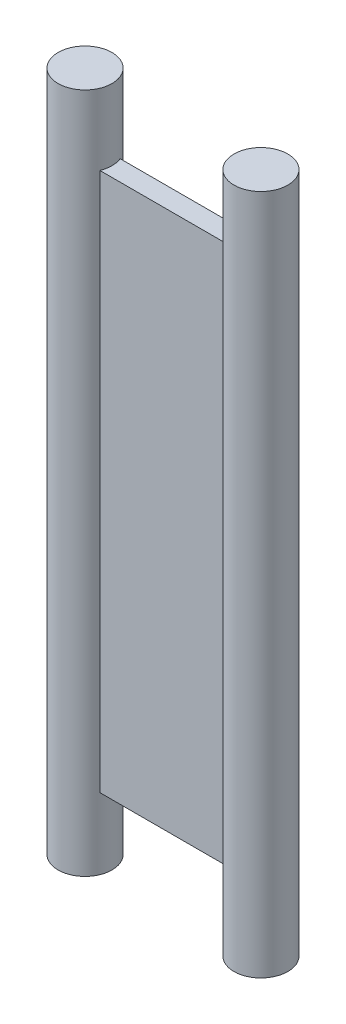
ISO-10303-21;
HEADER;
FILE_DESCRIPTION(('STEP AP214'),'2;1');
FILE_NAME('part.step','',(''),(''),'','','');
FILE_SCHEMA(('AUTOMOTIVE_DESIGN { 1 0 10303 214 1 1 1 1 }'));
ENDSEC;
DATA;
#1=APPLICATION_CONTEXT('core data for automotive mechanical design processes');
#2=APPLICATION_PROTOCOL_DEFINITION('international standard','automotive_design',2000,#1);
#3=PRODUCT_CONTEXT('',#1,'mechanical');
#4=PRODUCT('Part','Part','',(#3));
#5=PRODUCT_RELATED_PRODUCT_CATEGORY('part','',(#4));
#6=PRODUCT_DEFINITION_FORMATION('','',#4);
#7=PRODUCT_DEFINITION_CONTEXT('part definition',#1,'design');
#8=PRODUCT_DEFINITION('design','',#6,#7);
#9=PRODUCT_DEFINITION_SHAPE('','',#8);
#10=(LENGTH_UNIT() NAMED_UNIT(*) SI_UNIT(.MILLI.,.METRE.));
#11=(NAMED_UNIT(*) PLANE_ANGLE_UNIT() SI_UNIT($,.RADIAN.));
#12=(NAMED_UNIT(*) SI_UNIT($,.STERADIAN.) SOLID_ANGLE_UNIT());
#13=UNCERTAINTY_MEASURE_WITH_UNIT(LENGTH_MEASURE(1.E-05),#10,'distance_accuracy_value','');
#14=(GEOMETRIC_REPRESENTATION_CONTEXT(3) GLOBAL_UNCERTAINTY_ASSIGNED_CONTEXT((#13)) GLOBAL_UNIT_ASSIGNED_CONTEXT((#10,
#11,#12)) REPRESENTATION_CONTEXT('',''));
#15=CARTESIAN_POINT('',(0.,0.,0.));
#16=DIRECTION('',(0.,0.,1.));
#17=DIRECTION('',(1.,0.,0.));
#18=AXIS2_PLACEMENT_3D('',#15,#16,#17);
#19=CARTESIAN_POINT('',(4.325,26.5,0.499999999999999));
#20=DIRECTION('',(0.,0.,-1.));
#21=DIRECTION('',(-1.,0.,0.));
#22=AXIS2_PLACEMENT_3D('',#19,#20,#21);
#23=PLANE('',#22);
#24=DIRECTION('',(0.,-1.,0.));
#25=VECTOR('',#24,1.);
#26=CARTESIAN_POINT('',(3.0979608808192,30.,0.5));
#27=LINE('',#26,#25);
#28=CARTESIAN_POINT('',(3.0979608808192,26.5,0.5));
#29=VERTEX_POINT('',#28);
#30=CARTESIAN_POINT('',(3.0979608808192,0.,0.5));
#31=VERTEX_POINT('',#30);
#32=EDGE_CURVE('E53',#29,#31,#27,.T.);
#33=ORIENTED_EDGE('',*,*,#32,.F.);
#34=DIRECTION('',(1.,0.,0.));
#35=VECTOR('',#34,1.);
#36=CARTESIAN_POINT('',(4.325,26.5,0.499999999999999));
#37=LINE('',#36,#35);
#38=CARTESIAN_POINT('',(-3.0979608808192,26.5,0.5));
#39=VERTEX_POINT('',#38);
#40=EDGE_CURVE('E90',#39,#29,#37,.T.);
#41=ORIENTED_EDGE('',*,*,#40,.F.);
#42=DIRECTION('',(0.,-1.,0.));
#43=VECTOR('',#42,1.);
#44=CARTESIAN_POINT('',(-3.0979608808192,30.,0.5));
#45=LINE('',#44,#43);
#46=CARTESIAN_POINT('',(-3.0979608808192,0.,0.5));
#47=VERTEX_POINT('',#46);
#48=EDGE_CURVE('E103',#47,#39,#45,.F.);
#49=ORIENTED_EDGE('',*,*,#48,.F.);
#50=DIRECTION('',(1.,0.,0.));
#51=VECTOR('',#50,1.);
#52=CARTESIAN_POINT('',(4.325,0.,0.499999999999999));
#53=LINE('',#52,#51);
#54=EDGE_CURVE('E91',#47,#31,#53,.T.);
#55=ORIENTED_EDGE('',*,*,#54,.T.);
#56=EDGE_LOOP('',(#33,#41,#49,#55));
#57=FACE_BOUND('',#56,.T.);
#58=ADVANCED_FACE('F39',(#57),#23,.F.);
#59=CARTESIAN_POINT('',(4.325,26.5,-0.500000000000001));
#60=DIRECTION('',(0.,0.,1.));
#61=DIRECTION('',(1.,0.,0.));
#62=AXIS2_PLACEMENT_3D('',#59,#60,#61);
#63=PLANE('',#62);
#64=DIRECTION('',(0.,-1.,0.));
#65=VECTOR('',#64,1.);
#66=CARTESIAN_POINT('',(3.0979608808192,30.,-0.5));
#67=LINE('',#66,#65);
#68=CARTESIAN_POINT('',(3.0979608808192,0.,-0.5));
#69=VERTEX_POINT('',#68);
#70=CARTESIAN_POINT('',(3.0979608808192,26.5,-0.5));
#71=VERTEX_POINT('',#70);
#72=EDGE_CURVE('E78',#69,#71,#67,.F.);
#73=ORIENTED_EDGE('',*,*,#72,.F.);
#74=DIRECTION('',(-1.,0.,0.));
#75=VECTOR('',#74,1.);
#76=CARTESIAN_POINT('',(4.325,0.,-0.500000000000001));
#77=LINE('',#76,#75);
#78=CARTESIAN_POINT('',(-3.0979608808192,0.,-0.5));
#79=VERTEX_POINT('',#78);
#80=EDGE_CURVE('E60',#69,#79,#77,.T.);
#81=ORIENTED_EDGE('',*,*,#80,.T.);
#82=DIRECTION('',(0.,-1.,0.));
#83=VECTOR('',#82,1.);
#84=CARTESIAN_POINT('',(-3.0979608808192,30.,-0.5));
#85=LINE('',#84,#83);
#86=CARTESIAN_POINT('',(-3.0979608808192,26.5,-0.5));
#87=VERTEX_POINT('',#86);
#88=EDGE_CURVE('E105',#87,#79,#85,.T.);
#89=ORIENTED_EDGE('',*,*,#88,.F.);
#90=DIRECTION('',(-1.,0.,0.));
#91=VECTOR('',#90,1.);
#92=CARTESIAN_POINT('',(4.325,26.5,-0.500000000000001));
#93=LINE('',#92,#91);
#94=EDGE_CURVE('E85',#71,#87,#93,.T.);
#95=ORIENTED_EDGE('',*,*,#94,.F.);
#96=EDGE_LOOP('',(#73,#81,#89,#95));
#97=FACE_BOUND('',#96,.T.);
#98=ADVANCED_FACE('F84',(#97),#63,.F.);
#99=CARTESIAN_POINT('',(-4.325,30.,0.));
#100=DIRECTION('',(0.,-1.,0.));
#101=DIRECTION('',(0.,0.,-1.));
#102=AXIS2_PLACEMENT_3D('',#99,#100,#101);
#103=CYLINDRICAL_SURFACE('',#102,1.325);
#104=CARTESIAN_POINT('',(-4.325,30.,0.));
#105=DIRECTION('',(0.,1.,0.));
#106=DIRECTION('',(0.,0.,1.));
#107=AXIS2_PLACEMENT_3D('',#104,#105,#106);
#108=CIRCLE('',#107,1.325);
#109=CARTESIAN_POINT('',(-4.325,30.,1.325));
#110=VERTEX_POINT('',#109);
#111=EDGE_CURVE('E107',#110,#110,#108,.T.);
#112=ORIENTED_EDGE('',*,*,#111,.F.);
#113=EDGE_LOOP('',(#112));
#114=FACE_BOUND('',#113,.T.);
#115=CARTESIAN_POINT('',(-4.325,-3.5,0.));
#116=DIRECTION('',(0.,1.,0.));
#117=DIRECTION('',(0.,0.,1.));
#118=AXIS2_PLACEMENT_3D('',#115,#116,#117);
#119=CIRCLE('',#118,1.325);
#120=CARTESIAN_POINT('',(-4.325,-3.5,1.325));
#121=VERTEX_POINT('',#120);
#122=EDGE_CURVE('E108',#121,#121,#119,.T.);
#123=ORIENTED_EDGE('',*,*,#122,.T.);
#124=EDGE_LOOP('',(#123));
#125=FACE_BOUND('',#124,.T.);
#126=ORIENTED_EDGE('',*,*,#48,.T.);
#127=CARTESIAN_POINT('',(-4.325,26.5,0.));
#128=DIRECTION('',(0.,-1.,0.));
#129=DIRECTION('',(0.,0.,-1.));
#130=AXIS2_PLACEMENT_3D('',#127,#128,#129);
#131=CIRCLE('',#130,1.325);
#132=EDGE_CURVE('E95',#39,#87,#131,.F.);
#133=ORIENTED_EDGE('',*,*,#132,.T.);
#134=ORIENTED_EDGE('',*,*,#88,.T.);
#135=CARTESIAN_POINT('',(-4.325,0.,0.));
#136=DIRECTION('',(0.,-1.,0.));
#137=DIRECTION('',(0.,0.,-1.));
#138=AXIS2_PLACEMENT_3D('',#135,#136,#137);
#139=CIRCLE('',#138,1.325);
#140=EDGE_CURVE('E46',#47,#79,#139,.F.);
#141=ORIENTED_EDGE('',*,*,#140,.F.);
#142=EDGE_LOOP('',(#126,#133,#134,#141));
#143=FACE_BOUND('',#142,.T.);
#144=ADVANCED_FACE('F138',(#114,#125,#143),#103,.T.);
#145=CARTESIAN_POINT('',(-4.325,30.,0.));
#146=DIRECTION('',(0.,1.,0.));
#147=DIRECTION('',(0.,0.,1.));
#148=AXIS2_PLACEMENT_3D('',#145,#146,#147);
#149=PLANE('',#148);
#150=ORIENTED_EDGE('',*,*,#111,.T.);
#151=EDGE_LOOP('',(#150));
#152=FACE_BOUND('',#151,.T.);
#153=ADVANCED_FACE('F144',(#152),#149,.T.);
#154=CARTESIAN_POINT('',(-4.325,-3.5,0.));
#155=DIRECTION('',(0.,1.,0.));
#156=DIRECTION('',(0.,0.,1.));
#157=AXIS2_PLACEMENT_3D('',#154,#155,#156);
#158=PLANE('',#157);
#159=ORIENTED_EDGE('',*,*,#122,.F.);
#160=EDGE_LOOP('',(#159));
#161=FACE_BOUND('',#160,.T.);
#162=ADVANCED_FACE('F150',(#161),#158,.F.);
#163=CARTESIAN_POINT('',(0.,26.5,0.));
#164=DIRECTION('',(0.,-1.,0.));
#165=DIRECTION('',(0.,0.,-1.));
#166=AXIS2_PLACEMENT_3D('',#163,#164,#165);
#167=PLANE('',#166);
#168=CARTESIAN_POINT('',(4.325,26.5,0.));
#169=DIRECTION('',(0.,-1.,0.));
#170=DIRECTION('',(0.,0.,-1.));
#171=AXIS2_PLACEMENT_3D('',#168,#169,#170);
#172=CIRCLE('',#171,1.325);
#173=EDGE_CURVE('E111',#71,#29,#172,.F.);
#174=ORIENTED_EDGE('',*,*,#173,.F.);
#175=ORIENTED_EDGE('',*,*,#94,.T.);
#176=ORIENTED_EDGE('',*,*,#132,.F.);
#177=ORIENTED_EDGE('',*,*,#40,.T.);
#178=EDGE_LOOP('',(#174,#175,#176,#177));
#179=FACE_BOUND('',#178,.T.);
#180=ADVANCED_FACE('F141',(#179),#167,.F.);
#181=CARTESIAN_POINT('',(0.,0.,0.));
#182=DIRECTION('',(0.,-1.,0.));
#183=DIRECTION('',(0.,0.,-1.));
#184=AXIS2_PLACEMENT_3D('',#181,#182,#183);
#185=PLANE('',#184);
#186=ORIENTED_EDGE('',*,*,#80,.F.);
#187=CARTESIAN_POINT('',(4.325,0.,0.));
#188=DIRECTION('',(0.,-1.,0.));
#189=DIRECTION('',(0.,0.,-1.));
#190=AXIS2_PLACEMENT_3D('',#187,#188,#189);
#191=CIRCLE('',#190,1.325);
#192=EDGE_CURVE('E11',#69,#31,#191,.F.);
#193=ORIENTED_EDGE('',*,*,#192,.T.);
#194=ORIENTED_EDGE('',*,*,#54,.F.);
#195=ORIENTED_EDGE('',*,*,#140,.T.);
#196=EDGE_LOOP('',(#186,#193,#194,#195));
#197=FACE_BOUND('',#196,.T.);
#198=ADVANCED_FACE('F89',(#197),#185,.T.);
#199=CARTESIAN_POINT('',(4.325,30.,0.));
#200=DIRECTION('',(0.,-1.,0.));
#201=DIRECTION('',(0.,0.,-1.));
#202=AXIS2_PLACEMENT_3D('',#199,#200,#201);
#203=CYLINDRICAL_SURFACE('',#202,1.325);
#204=CARTESIAN_POINT('',(4.325,30.,0.));
#205=DIRECTION('',(0.,1.,0.));
#206=DIRECTION('',(0.,0.,1.));
#207=AXIS2_PLACEMENT_3D('',#204,#205,#206);
#208=CIRCLE('',#207,1.325);
#209=CARTESIAN_POINT('',(4.325,30.,1.325));
#210=VERTEX_POINT('',#209);
#211=EDGE_CURVE('E116',#210,#210,#208,.T.);
#212=ORIENTED_EDGE('',*,*,#211,.F.);
#213=EDGE_LOOP('',(#212));
#214=FACE_BOUND('',#213,.T.);
#215=CARTESIAN_POINT('',(4.325,-3.5,0.));
#216=DIRECTION('',(0.,1.,0.));
#217=DIRECTION('',(0.,0.,1.));
#218=AXIS2_PLACEMENT_3D('',#215,#216,#217);
#219=CIRCLE('',#218,1.325);
#220=CARTESIAN_POINT('',(4.325,-3.5,1.325));
#221=VERTEX_POINT('',#220);
#222=EDGE_CURVE('E86',#221,#221,#219,.T.);
#223=ORIENTED_EDGE('',*,*,#222,.T.);
#224=EDGE_LOOP('',(#223));
#225=FACE_BOUND('',#224,.T.);
#226=ORIENTED_EDGE('',*,*,#72,.T.);
#227=ORIENTED_EDGE('',*,*,#173,.T.);
#228=ORIENTED_EDGE('',*,*,#32,.T.);
#229=ORIENTED_EDGE('',*,*,#192,.F.);
#230=EDGE_LOOP('',(#226,#227,#228,#229));
#231=FACE_BOUND('',#230,.T.);
#232=ADVANCED_FACE('F77',(#214,#225,#231),#203,.T.);
#233=CARTESIAN_POINT('',(4.325,30.,0.));
#234=DIRECTION('',(0.,1.,0.));
#235=DIRECTION('',(0.,0.,1.));
#236=AXIS2_PLACEMENT_3D('',#233,#234,#235);
#237=PLANE('',#236);
#238=ORIENTED_EDGE('',*,*,#211,.T.);
#239=EDGE_LOOP('',(#238));
#240=FACE_BOUND('',#239,.T.);
#241=ADVANCED_FACE('F125',(#240),#237,.T.);
#242=CARTESIAN_POINT('',(4.325,-3.5,0.));
#243=DIRECTION('',(0.,1.,0.));
#244=DIRECTION('',(0.,0.,1.));
#245=AXIS2_PLACEMENT_3D('',#242,#243,#244);
#246=PLANE('',#245);
#247=ORIENTED_EDGE('',*,*,#222,.F.);
#248=EDGE_LOOP('',(#247));
#249=FACE_BOUND('',#248,.T.);
#250=ADVANCED_FACE('F123',(#249),#246,.F.);
#251=CLOSED_SHELL('',(#58,#98,#144,#153,#162,#180,#198,#232,#241,#250));
#252=MANIFOLD_SOLID_BREP('B2',#251);
#253=ADVANCED_BREP_SHAPE_REPRESENTATION('',(#18,#252),#14);
#254=SHAPE_DEFINITION_REPRESENTATION(#9,#253);
ENDSEC;
END-ISO-10303-21;
